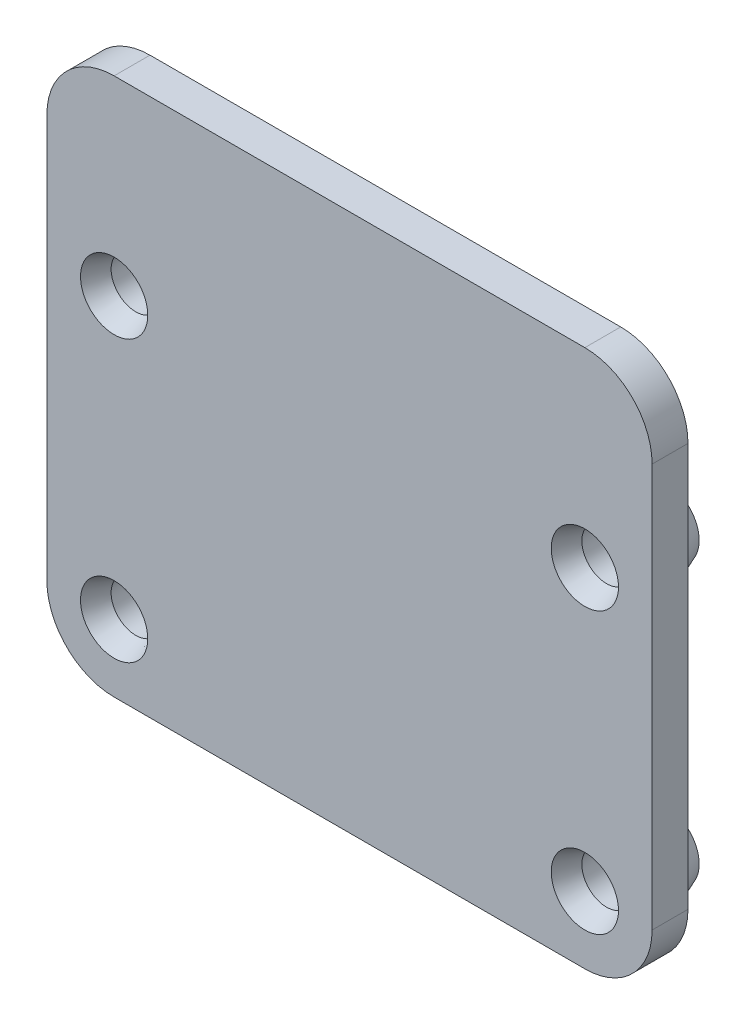
ISO-10303-21;
HEADER;
FILE_DESCRIPTION(('STEP AP214'),'2;1');
FILE_NAME('part.step','',(''),(''),'','','');
FILE_SCHEMA(('AUTOMOTIVE_DESIGN { 1 0 10303 214 1 1 1 1 }'));
ENDSEC;
DATA;
#1=APPLICATION_CONTEXT('core data for automotive mechanical design processes');
#2=APPLICATION_PROTOCOL_DEFINITION('international standard','automotive_design',2000,#1);
#3=PRODUCT_CONTEXT('',#1,'mechanical');
#4=PRODUCT('Part','Part','',(#3));
#5=PRODUCT_RELATED_PRODUCT_CATEGORY('part','',(#4));
#6=PRODUCT_DEFINITION_FORMATION('','',#4);
#7=PRODUCT_DEFINITION_CONTEXT('part definition',#1,'design');
#8=PRODUCT_DEFINITION('design','',#6,#7);
#9=PRODUCT_DEFINITION_SHAPE('','',#8);
#10=(LENGTH_UNIT() NAMED_UNIT(*) SI_UNIT(.MILLI.,.METRE.));
#11=(NAMED_UNIT(*) PLANE_ANGLE_UNIT() SI_UNIT($,.RADIAN.));
#12=(NAMED_UNIT(*) SI_UNIT($,.STERADIAN.) SOLID_ANGLE_UNIT());
#13=UNCERTAINTY_MEASURE_WITH_UNIT(LENGTH_MEASURE(1.E-05),#10,'distance_accuracy_value','');
#14=(GEOMETRIC_REPRESENTATION_CONTEXT(3) GLOBAL_UNCERTAINTY_ASSIGNED_CONTEXT((#13)) GLOBAL_UNIT_ASSIGNED_CONTEXT((#10,
#11,#12)) REPRESENTATION_CONTEXT('',''));
#15=CARTESIAN_POINT('',(0.,0.,0.));
#16=DIRECTION('',(0.,0.,1.));
#17=DIRECTION('',(1.,0.,0.));
#18=AXIS2_PLACEMENT_3D('',#15,#16,#17);
#19=CARTESIAN_POINT('',(-10.50000068,-7.51999610240276,1.6));
#20=DIRECTION('',(0.,0.,-1.));
#21=DIRECTION('',(-1.,0.,0.));
#22=AXIS2_PLACEMENT_3D('',#19,#20,#21);
#23=CYLINDRICAL_SURFACE('',#22,3.);
#24=CARTESIAN_POINT('',(-10.50000068,-7.51999610240276,0.));
#25=DIRECTION('',(0.,0.,1.));
#26=DIRECTION('',(-1.,0.,0.));
#27=AXIS2_PLACEMENT_3D('',#24,#25,#26);
#28=CIRCLE('',#27,3.);
#29=CARTESIAN_POINT('',(-13.50000068,-7.51999610240274,0.));
#30=VERTEX_POINT('',#29);
#31=CARTESIAN_POINT('',(-10.5000006799999,-10.5199961024028,0.));
#32=VERTEX_POINT('',#31);
#33=EDGE_CURVE('E134',#30,#32,#28,.T.);
#34=ORIENTED_EDGE('',*,*,#33,.T.);
#35=DIRECTION('',(0.,0.,-1.));
#36=VECTOR('',#35,1.);
#37=CARTESIAN_POINT('',(-10.5000006799999,-10.5199961024028,1.6));
#38=LINE('',#37,#36);
#39=CARTESIAN_POINT('',(-10.5000006799999,-10.5199961024028,1.6));
#40=VERTEX_POINT('',#39);
#41=EDGE_CURVE('E162',#40,#32,#38,.T.);
#42=ORIENTED_EDGE('',*,*,#41,.F.);
#43=CARTESIAN_POINT('',(-10.50000068,-7.51999610240276,1.6));
#44=DIRECTION('',(0.,0.,1.));
#45=DIRECTION('',(-1.,0.,0.));
#46=AXIS2_PLACEMENT_3D('',#43,#44,#45);
#47=CIRCLE('',#46,3.);
#48=CARTESIAN_POINT('',(-13.50000068,-7.51999610240274,1.6));
#49=VERTEX_POINT('',#48);
#50=EDGE_CURVE('E149',#49,#40,#47,.T.);
#51=ORIENTED_EDGE('',*,*,#50,.F.);
#52=DIRECTION('',(0.,0.,-1.));
#53=VECTOR('',#52,1.);
#54=CARTESIAN_POINT('',(-13.50000068,-7.51999610240274,1.6));
#55=LINE('',#54,#53);
#56=EDGE_CURVE('E130',#49,#30,#55,.T.);
#57=ORIENTED_EDGE('',*,*,#56,.T.);
#58=EDGE_LOOP('',(#34,#42,#51,#57));
#59=FACE_BOUND('',#58,.T.);
#60=ADVANCED_FACE('F35',(#59),#23,.T.);
#61=CARTESIAN_POINT('',(10.5000006799999,-10.5199961024028,1.6));
#62=DIRECTION('',(0.,1.,0.));
#63=DIRECTION('',(-1.,0.,0.));
#64=AXIS2_PLACEMENT_3D('',#61,#62,#63);
#65=PLANE('',#64);
#66=DIRECTION('',(1.,0.,0.));
#67=VECTOR('',#66,1.);
#68=CARTESIAN_POINT('',(10.5000006799999,-10.5199961024028,0.));
#69=LINE('',#68,#67);
#70=CARTESIAN_POINT('',(10.5000006799999,-10.5199961024028,0.));
#71=VERTEX_POINT('',#70);
#72=EDGE_CURVE('E137',#32,#71,#69,.T.);
#73=ORIENTED_EDGE('',*,*,#72,.T.);
#74=DIRECTION('',(0.,0.,-1.));
#75=VECTOR('',#74,1.);
#76=CARTESIAN_POINT('',(10.5000006799999,-10.5199961024028,1.6));
#77=LINE('',#76,#75);
#78=CARTESIAN_POINT('',(10.5000006799999,-10.5199961024028,1.6));
#79=VERTEX_POINT('',#78);
#80=EDGE_CURVE('E159',#79,#71,#77,.T.);
#81=ORIENTED_EDGE('',*,*,#80,.F.);
#82=DIRECTION('',(1.,0.,0.));
#83=VECTOR('',#82,1.);
#84=CARTESIAN_POINT('',(10.5000006799999,-10.5199961024028,1.6));
#85=LINE('',#84,#83);
#86=EDGE_CURVE('E97',#40,#79,#85,.T.);
#87=ORIENTED_EDGE('',*,*,#86,.F.);
#88=ORIENTED_EDGE('',*,*,#41,.T.);
#89=EDGE_LOOP('',(#73,#81,#87,#88));
#90=FACE_BOUND('',#89,.T.);
#91=ADVANCED_FACE('F190',(#90),#65,.F.);
#92=CARTESIAN_POINT('',(10.50000068,-7.51999610240276,1.6));
#93=DIRECTION('',(0.,0.,-1.));
#94=DIRECTION('',(-1.,0.,0.));
#95=AXIS2_PLACEMENT_3D('',#92,#93,#94);
#96=CYLINDRICAL_SURFACE('',#95,3.);
#97=CARTESIAN_POINT('',(10.50000068,-7.51999610240276,0.));
#98=DIRECTION('',(0.,0.,1.));
#99=DIRECTION('',(-1.,0.,0.));
#100=AXIS2_PLACEMENT_3D('',#97,#98,#99);
#101=CIRCLE('',#100,3.);
#102=CARTESIAN_POINT('',(13.50000068,-7.51999610240274,0.));
#103=VERTEX_POINT('',#102);
#104=EDGE_CURVE('E140',#71,#103,#101,.T.);
#105=ORIENTED_EDGE('',*,*,#104,.T.);
#106=DIRECTION('',(0.,0.,-1.));
#107=VECTOR('',#106,1.);
#108=CARTESIAN_POINT('',(13.50000068,-7.51999610240274,1.6));
#109=LINE('',#108,#107);
#110=CARTESIAN_POINT('',(13.50000068,-7.51999610240274,1.6));
#111=VERTEX_POINT('',#110);
#112=EDGE_CURVE('E156',#111,#103,#109,.T.);
#113=ORIENTED_EDGE('',*,*,#112,.F.);
#114=CARTESIAN_POINT('',(10.50000068,-7.51999610240276,1.6));
#115=DIRECTION('',(0.,0.,1.));
#116=DIRECTION('',(-1.,0.,0.));
#117=AXIS2_PLACEMENT_3D('',#114,#115,#116);
#118=CIRCLE('',#117,3.);
#119=EDGE_CURVE('E261',#79,#111,#118,.T.);
#120=ORIENTED_EDGE('',*,*,#119,.F.);
#121=ORIENTED_EDGE('',*,*,#80,.T.);
#122=EDGE_LOOP('',(#105,#113,#120,#121));
#123=FACE_BOUND('',#122,.T.);
#124=ADVANCED_FACE('F196',(#123),#96,.T.);
#125=CARTESIAN_POINT('',(13.50000068,10.4800038975972,1.6));
#126=DIRECTION('',(-1.,0.,0.));
#127=DIRECTION('',(0.,-1.,0.));
#128=AXIS2_PLACEMENT_3D('',#125,#126,#127);
#129=PLANE('',#128);
#130=DIRECTION('',(0.,1.,0.));
#131=VECTOR('',#130,1.);
#132=CARTESIAN_POINT('',(13.50000068,10.4800038975972,0.));
#133=LINE('',#132,#131);
#134=CARTESIAN_POINT('',(13.50000068,10.4800038975972,0.));
#135=VERTEX_POINT('',#134);
#136=EDGE_CURVE('E142',#103,#135,#133,.T.);
#137=ORIENTED_EDGE('',*,*,#136,.T.);
#138=DIRECTION('',(0.,0.,-1.));
#139=VECTOR('',#138,1.);
#140=CARTESIAN_POINT('',(13.50000068,10.4800038975972,1.6));
#141=LINE('',#140,#139);
#142=CARTESIAN_POINT('',(13.50000068,10.4800038975972,1.6));
#143=VERTEX_POINT('',#142);
#144=EDGE_CURVE('E153',#143,#135,#141,.T.);
#145=ORIENTED_EDGE('',*,*,#144,.F.);
#146=DIRECTION('',(0.,1.,0.));
#147=VECTOR('',#146,1.);
#148=CARTESIAN_POINT('',(13.50000068,10.4800038975972,1.6));
#149=LINE('',#148,#147);
#150=EDGE_CURVE('E263',#111,#143,#149,.T.);
#151=ORIENTED_EDGE('',*,*,#150,.F.);
#152=ORIENTED_EDGE('',*,*,#112,.T.);
#153=EDGE_LOOP('',(#137,#145,#151,#152));
#154=FACE_BOUND('',#153,.T.);
#155=ADVANCED_FACE('F269',(#154),#129,.F.);
#156=CARTESIAN_POINT('',(10.50000068,10.4800038975972,1.6));
#157=DIRECTION('',(0.,0.,-1.));
#158=DIRECTION('',(-1.,0.,0.));
#159=AXIS2_PLACEMENT_3D('',#156,#157,#158);
#160=CYLINDRICAL_SURFACE('',#159,3.);
#161=CARTESIAN_POINT('',(10.50000068,10.4800038975972,0.));
#162=DIRECTION('',(0.,0.,1.));
#163=DIRECTION('',(-1.,0.,0.));
#164=AXIS2_PLACEMENT_3D('',#161,#162,#163);
#165=CIRCLE('',#164,3.);
#166=CARTESIAN_POINT('',(10.5000006799999,13.4800038975972,0.));
#167=VERTEX_POINT('',#166);
#168=EDGE_CURVE('E144',#135,#167,#165,.T.);
#169=ORIENTED_EDGE('',*,*,#168,.T.);
#170=DIRECTION('',(0.,0.,-1.));
#171=VECTOR('',#170,1.);
#172=CARTESIAN_POINT('',(10.5000006799999,13.4800038975972,1.6));
#173=LINE('',#172,#171);
#174=CARTESIAN_POINT('',(10.5000006799999,13.4800038975972,1.6));
#175=VERTEX_POINT('',#174);
#176=EDGE_CURVE('E125',#175,#167,#173,.T.);
#177=ORIENTED_EDGE('',*,*,#176,.F.);
#178=CARTESIAN_POINT('',(10.50000068,10.4800038975972,1.6));
#179=DIRECTION('',(0.,0.,1.));
#180=DIRECTION('',(-1.,0.,0.));
#181=AXIS2_PLACEMENT_3D('',#178,#179,#180);
#182=CIRCLE('',#181,3.);
#183=EDGE_CURVE('E116',#143,#175,#182,.T.);
#184=ORIENTED_EDGE('',*,*,#183,.F.);
#185=ORIENTED_EDGE('',*,*,#144,.T.);
#186=EDGE_LOOP('',(#169,#177,#184,#185));
#187=FACE_BOUND('',#186,.T.);
#188=ADVANCED_FACE('F273',(#187),#160,.T.);
#189=CARTESIAN_POINT('',(10.5000006799999,13.4800038975972,1.6));
#190=DIRECTION('',(0.,-1.,0.));
#191=DIRECTION('',(1.,0.,0.));
#192=AXIS2_PLACEMENT_3D('',#189,#190,#191);
#193=PLANE('',#192);
#194=DIRECTION('',(-1.,0.,0.));
#195=VECTOR('',#194,1.);
#196=CARTESIAN_POINT('',(10.5000006799999,13.4800038975972,0.));
#197=LINE('',#196,#195);
#198=CARTESIAN_POINT('',(-10.5000006799999,13.4800038975972,0.));
#199=VERTEX_POINT('',#198);
#200=EDGE_CURVE('E124',#167,#199,#197,.T.);
#201=ORIENTED_EDGE('',*,*,#200,.T.);
#202=DIRECTION('',(0.,0.,-1.));
#203=VECTOR('',#202,1.);
#204=CARTESIAN_POINT('',(-10.5000006799999,13.4800038975972,1.6));
#205=LINE('',#204,#203);
#206=CARTESIAN_POINT('',(-10.5000006799999,13.4800038975972,1.6));
#207=VERTEX_POINT('',#206);
#208=EDGE_CURVE('E121',#207,#199,#205,.T.);
#209=ORIENTED_EDGE('',*,*,#208,.F.);
#210=DIRECTION('',(-1.,0.,0.));
#211=VECTOR('',#210,1.);
#212=CARTESIAN_POINT('',(10.5000006799999,13.4800038975972,1.6));
#213=LINE('',#212,#211);
#214=EDGE_CURVE('E110',#175,#207,#213,.T.);
#215=ORIENTED_EDGE('',*,*,#214,.F.);
#216=ORIENTED_EDGE('',*,*,#176,.T.);
#217=EDGE_LOOP('',(#201,#209,#215,#216));
#218=FACE_BOUND('',#217,.T.);
#219=ADVANCED_FACE('F122',(#218),#193,.F.);
#220=CARTESIAN_POINT('',(-10.50000068,10.4800038975972,1.6));
#221=DIRECTION('',(0.,0.,-1.));
#222=DIRECTION('',(-1.,0.,0.));
#223=AXIS2_PLACEMENT_3D('',#220,#221,#222);
#224=CYLINDRICAL_SURFACE('',#223,3.);
#225=CARTESIAN_POINT('',(-10.50000068,10.4800038975972,0.));
#226=DIRECTION('',(0.,0.,1.));
#227=DIRECTION('',(1.,0.,0.));
#228=AXIS2_PLACEMENT_3D('',#225,#226,#227);
#229=CIRCLE('',#228,3.);
#230=CARTESIAN_POINT('',(-13.50000068,10.4800038975972,0.));
#231=VERTEX_POINT('',#230);
#232=EDGE_CURVE('E82',#199,#231,#229,.T.);
#233=ORIENTED_EDGE('',*,*,#232,.T.);
#234=DIRECTION('',(0.,0.,-1.));
#235=VECTOR('',#234,1.);
#236=CARTESIAN_POINT('',(-13.50000068,10.4800038975972,1.6));
#237=LINE('',#236,#235);
#238=CARTESIAN_POINT('',(-13.50000068,10.4800038975972,1.6));
#239=VERTEX_POINT('',#238);
#240=EDGE_CURVE('E126',#239,#231,#237,.T.);
#241=ORIENTED_EDGE('',*,*,#240,.F.);
#242=CARTESIAN_POINT('',(-10.50000068,10.4800038975972,1.6));
#243=DIRECTION('',(0.,0.,1.));
#244=DIRECTION('',(1.,0.,0.));
#245=AXIS2_PLACEMENT_3D('',#242,#243,#244);
#246=CIRCLE('',#245,3.);
#247=EDGE_CURVE('E114',#207,#239,#246,.T.);
#248=ORIENTED_EDGE('',*,*,#247,.F.);
#249=ORIENTED_EDGE('',*,*,#208,.T.);
#250=EDGE_LOOP('',(#233,#241,#248,#249));
#251=FACE_BOUND('',#250,.T.);
#252=ADVANCED_FACE('F128',(#251),#224,.T.);
#253=CARTESIAN_POINT('',(-13.50000068,10.4800038975972,1.6));
#254=DIRECTION('',(1.,0.,0.));
#255=DIRECTION('',(0.,1.,0.));
#256=AXIS2_PLACEMENT_3D('',#253,#254,#255);
#257=PLANE('',#256);
#258=DIRECTION('',(0.,-1.,0.));
#259=VECTOR('',#258,1.);
#260=CARTESIAN_POINT('',(-13.50000068,10.4800038975972,0.));
#261=LINE('',#260,#259);
#262=EDGE_CURVE('E88',#231,#30,#261,.T.);
#263=ORIENTED_EDGE('',*,*,#262,.T.);
#264=ORIENTED_EDGE('',*,*,#56,.F.);
#265=DIRECTION('',(0.,-1.,0.));
#266=VECTOR('',#265,1.);
#267=CARTESIAN_POINT('',(-13.50000068,10.4800038975972,1.6));
#268=LINE('',#267,#266);
#269=EDGE_CURVE('E53',#239,#49,#268,.T.);
#270=ORIENTED_EDGE('',*,*,#269,.F.);
#271=ORIENTED_EDGE('',*,*,#240,.T.);
#272=EDGE_LOOP('',(#263,#264,#270,#271));
#273=FACE_BOUND('',#272,.T.);
#274=ADVANCED_FACE('F280',(#273),#257,.F.);
#275=CARTESIAN_POINT('',(-10.50000068,-7.51999610240276,1.6));
#276=DIRECTION('',(0.,0.,-1.));
#277=DIRECTION('',(-1.,0.,0.));
#278=AXIS2_PLACEMENT_3D('',#275,#276,#277);
#279=PLANE('',#278);
#280=CARTESIAN_POINT('',(10.5000012647635,4.98000389759722,1.6));
#281=DIRECTION('',(0.,0.,1.));
#282=DIRECTION('',(1.,0.,0.));
#283=AXIS2_PLACEMENT_3D('',#280,#281,#282);
#284=CIRCLE('',#283,1.5);
#285=CARTESIAN_POINT('',(12.0000012647635,4.98000389759722,1.6));
#286=VERTEX_POINT('',#285);
#287=EDGE_CURVE('E487',#286,#286,#284,.T.);
#288=ORIENTED_EDGE('',*,*,#287,.F.);
#289=EDGE_LOOP('',(#288));
#290=FACE_BOUND('',#289,.T.);
#291=CARTESIAN_POINT('',(10.50000068,-7.51999610240276,1.6));
#292=DIRECTION('',(0.,0.,1.));
#293=DIRECTION('',(1.,0.,0.));
#294=AXIS2_PLACEMENT_3D('',#291,#292,#293);
#295=CIRCLE('',#294,1.5);
#296=CARTESIAN_POINT('',(12.00000068,-7.51999610240276,1.6));
#297=VERTEX_POINT('',#296);
#298=EDGE_CURVE('E476',#297,#297,#295,.T.);
#299=ORIENTED_EDGE('',*,*,#298,.F.);
#300=EDGE_LOOP('',(#299));
#301=FACE_BOUND('',#300,.T.);
#302=CARTESIAN_POINT('',(-10.49999932,-7.51999511999999,1.6));
#303=DIRECTION('',(0.,0.,1.));
#304=DIRECTION('',(1.,0.,0.));
#305=AXIS2_PLACEMENT_3D('',#302,#303,#304);
#306=CIRCLE('',#305,1.5);
#307=CARTESIAN_POINT('',(-8.99999931999997,-7.51999511999999,1.6));
#308=VERTEX_POINT('',#307);
#309=EDGE_CURVE('E242',#308,#308,#306,.T.);
#310=ORIENTED_EDGE('',*,*,#309,.F.);
#311=EDGE_LOOP('',(#310));
#312=FACE_BOUND('',#311,.T.);
#313=CARTESIAN_POINT('',(-10.4999987352365,4.98000487999999,1.6));
#314=DIRECTION('',(0.,0.,1.));
#315=DIRECTION('',(1.,0.,0.));
#316=AXIS2_PLACEMENT_3D('',#313,#314,#315);
#317=CIRCLE('',#316,1.5);
#318=CARTESIAN_POINT('',(-8.99999873523645,4.98000487999999,1.6));
#319=VERTEX_POINT('',#318);
#320=EDGE_CURVE('E235',#319,#319,#317,.T.);
#321=ORIENTED_EDGE('',*,*,#320,.F.);
#322=EDGE_LOOP('',(#321));
#323=FACE_BOUND('',#322,.T.);
#324=ORIENTED_EDGE('',*,*,#50,.T.);
#325=ORIENTED_EDGE('',*,*,#86,.T.);
#326=ORIENTED_EDGE('',*,*,#119,.T.);
#327=ORIENTED_EDGE('',*,*,#150,.T.);
#328=ORIENTED_EDGE('',*,*,#183,.T.);
#329=ORIENTED_EDGE('',*,*,#214,.T.);
#330=ORIENTED_EDGE('',*,*,#247,.T.);
#331=ORIENTED_EDGE('',*,*,#269,.T.);
#332=EDGE_LOOP('',(#324,#325,#326,#327,#328,#329,#330,#331));
#333=FACE_BOUND('',#332,.T.);
#334=ADVANCED_FACE('F112',(#290,#301,#312,#323,#333),#279,.F.);
#335=CARTESIAN_POINT('',(-10.50000068,-7.51999610240276,0.));
#336=DIRECTION('',(0.,0.,-1.));
#337=DIRECTION('',(-1.,0.,0.));
#338=AXIS2_PLACEMENT_3D('',#335,#336,#337);
#339=PLANE('',#338);
#340=CARTESIAN_POINT('',(10.50000068,-7.51999610240276,0.));
#341=DIRECTION('',(0.,0.,-1.));
#342=DIRECTION('',(-1.,0.,0.));
#343=AXIS2_PLACEMENT_3D('',#340,#341,#342);
#344=CIRCLE('',#343,2.3);
#345=CARTESIAN_POINT('',(8.20000067999997,-7.51999610240276,0.));
#346=VERTEX_POINT('',#345);
#347=EDGE_CURVE('E251',#346,#346,#344,.T.);
#348=ORIENTED_EDGE('',*,*,#347,.F.);
#349=EDGE_LOOP('',(#348));
#350=FACE_BOUND('',#349,.T.);
#351=CARTESIAN_POINT('',(-10.50000068,-7.51999610240276,0.));
#352=DIRECTION('',(0.,0.,-1.));
#353=DIRECTION('',(-1.,0.,0.));
#354=AXIS2_PLACEMENT_3D('',#351,#352,#353);
#355=CIRCLE('',#354,2.3);
#356=CARTESIAN_POINT('',(-12.80000068,-7.51999610240276,0.));
#357=VERTEX_POINT('',#356);
#358=EDGE_CURVE('E222',#357,#357,#355,.T.);
#359=ORIENTED_EDGE('',*,*,#358,.F.);
#360=EDGE_LOOP('',(#359));
#361=FACE_BOUND('',#360,.T.);
#362=CARTESIAN_POINT('',(-10.4999987352365,4.98000487999999,0.));
#363=DIRECTION('',(0.,0.,-1.));
#364=DIRECTION('',(-1.,0.,0.));
#365=AXIS2_PLACEMENT_3D('',#362,#363,#364);
#366=CIRCLE('',#365,2.3);
#367=CARTESIAN_POINT('',(-12.7999987352365,4.98000487999999,0.));
#368=VERTEX_POINT('',#367);
#369=EDGE_CURVE('E255',#368,#368,#366,.T.);
#370=ORIENTED_EDGE('',*,*,#369,.F.);
#371=EDGE_LOOP('',(#370));
#372=FACE_BOUND('',#371,.T.);
#373=CARTESIAN_POINT('',(10.5000012647635,4.98000389759722,0.));
#374=DIRECTION('',(0.,0.,-1.));
#375=DIRECTION('',(-1.,0.,0.));
#376=AXIS2_PLACEMENT_3D('',#373,#374,#375);
#377=CIRCLE('',#376,2.3);
#378=CARTESIAN_POINT('',(8.20000126476353,4.98000389759722,0.));
#379=VERTEX_POINT('',#378);
#380=EDGE_CURVE('E138',#379,#379,#377,.T.);
#381=ORIENTED_EDGE('',*,*,#380,.F.);
#382=EDGE_LOOP('',(#381));
#383=FACE_BOUND('',#382,.T.);
#384=ORIENTED_EDGE('',*,*,#33,.F.);
#385=ORIENTED_EDGE('',*,*,#262,.F.);
#386=ORIENTED_EDGE('',*,*,#232,.F.);
#387=ORIENTED_EDGE('',*,*,#200,.F.);
#388=ORIENTED_EDGE('',*,*,#168,.F.);
#389=ORIENTED_EDGE('',*,*,#136,.F.);
#390=ORIENTED_EDGE('',*,*,#104,.F.);
#391=ORIENTED_EDGE('',*,*,#72,.F.);
#392=EDGE_LOOP('',(#384,#385,#386,#387,#388,#389,#390,#391));
#393=FACE_BOUND('',#392,.T.);
#394=ADVANCED_FACE('F276',(#350,#361,#372,#383,#393),#339,.T.);
#395=CARTESIAN_POINT('',(10.5000012647635,4.98000389759722,-2.));
#396=DIRECTION('',(0.,0.,-1.));
#397=DIRECTION('',(-1.,0.,0.));
#398=AXIS2_PLACEMENT_3D('',#395,#396,#397);
#399=PLANE('',#398);
#400=CARTESIAN_POINT('',(10.5000012647635,4.98000389759722,-2.));
#401=DIRECTION('',(0.,0.,-1.));
#402=DIRECTION('',(-1.,0.,0.));
#403=AXIS2_PLACEMENT_3D('',#400,#401,#402);
#404=CIRCLE('',#403,1.49999999999999);
#405=CARTESIAN_POINT('',(9.00000126476354,4.98000389759722,-2.));
#406=VERTEX_POINT('',#405);
#407=EDGE_CURVE('E45',#406,#406,#404,.T.);
#408=ORIENTED_EDGE('',*,*,#407,.T.);
#409=EDGE_LOOP('',(#408));
#410=FACE_BOUND('',#409,.T.);
#411=CARTESIAN_POINT('',(10.5000012647635,4.98000389759722,-2.));
#412=DIRECTION('',(0.,0.,1.));
#413=DIRECTION('',(1.,0.,0.));
#414=AXIS2_PLACEMENT_3D('',#411,#412,#413);
#415=CIRCLE('',#414,1.1);
#416=CARTESIAN_POINT('',(11.6000012647635,4.98000389759722,-2.));
#417=VERTEX_POINT('',#416);
#418=EDGE_CURVE('E481',#417,#417,#415,.T.);
#419=ORIENTED_EDGE('',*,*,#418,.T.);
#420=EDGE_LOOP('',(#419));
#421=FACE_BOUND('',#420,.T.);
#422=ADVANCED_FACE('F172',(#410,#421),#399,.T.);
#423=CARTESIAN_POINT('',(-10.4999987352365,4.98000487999999,-2.));
#424=DIRECTION('',(0.,0.,-1.));
#425=DIRECTION('',(-1.,0.,0.));
#426=AXIS2_PLACEMENT_3D('',#423,#424,#425);
#427=PLANE('',#426);
#428=CARTESIAN_POINT('',(-10.4999987352365,4.98000487999999,-2.));
#429=DIRECTION('',(0.,0.,-1.));
#430=DIRECTION('',(-1.,0.,0.));
#431=AXIS2_PLACEMENT_3D('',#428,#429,#430);
#432=CIRCLE('',#431,1.49999999999999);
#433=CARTESIAN_POINT('',(-11.9999987352364,4.98000487999999,-2.));
#434=VERTEX_POINT('',#433);
#435=EDGE_CURVE('E167',#434,#434,#432,.T.);
#436=ORIENTED_EDGE('',*,*,#435,.T.);
#437=EDGE_LOOP('',(#436));
#438=FACE_BOUND('',#437,.T.);
#439=CARTESIAN_POINT('',(-10.4999987352365,4.98000487999999,-2.));
#440=DIRECTION('',(0.,0.,1.));
#441=DIRECTION('',(1.,0.,0.));
#442=AXIS2_PLACEMENT_3D('',#439,#440,#441);
#443=CIRCLE('',#442,1.1);
#444=CARTESIAN_POINT('',(-9.39999873523645,4.98000487999999,-2.));
#445=VERTEX_POINT('',#444);
#446=EDGE_CURVE('E248',#445,#445,#443,.T.);
#447=ORIENTED_EDGE('',*,*,#446,.T.);
#448=EDGE_LOOP('',(#447));
#449=FACE_BOUND('',#448,.T.);
#450=ADVANCED_FACE('F229',(#438,#449),#427,.T.);
#451=CARTESIAN_POINT('',(-10.50000068,-7.51999610240276,-2.));
#452=DIRECTION('',(0.,0.,-1.));
#453=DIRECTION('',(-1.,0.,0.));
#454=AXIS2_PLACEMENT_3D('',#451,#452,#453);
#455=PLANE('',#454);
#456=CARTESIAN_POINT('',(-10.50000068,-7.51999610240276,-2.));
#457=DIRECTION('',(0.,0.,-1.));
#458=DIRECTION('',(-1.,0.,0.));
#459=AXIS2_PLACEMENT_3D('',#456,#457,#458);
#460=CIRCLE('',#459,1.49999999999999);
#461=CARTESIAN_POINT('',(-12.00000068,-7.51999610240276,-2.));
#462=VERTEX_POINT('',#461);
#463=EDGE_CURVE('E164',#462,#462,#460,.T.);
#464=ORIENTED_EDGE('',*,*,#463,.T.);
#465=EDGE_LOOP('',(#464));
#466=FACE_BOUND('',#465,.T.);
#467=CARTESIAN_POINT('',(-10.49999932,-7.51999511999999,-2.));
#468=DIRECTION('',(0.,0.,1.));
#469=DIRECTION('',(1.,0.,0.));
#470=AXIS2_PLACEMENT_3D('',#467,#468,#469);
#471=CIRCLE('',#470,1.1);
#472=CARTESIAN_POINT('',(-9.39999931999997,-7.51999511999999,-2.));
#473=VERTEX_POINT('',#472);
#474=EDGE_CURVE('E233',#473,#473,#471,.T.);
#475=ORIENTED_EDGE('',*,*,#474,.T.);
#476=EDGE_LOOP('',(#475));
#477=FACE_BOUND('',#476,.T.);
#478=ADVANCED_FACE('F225',(#466,#477),#455,.T.);
#479=CARTESIAN_POINT('',(10.50000068,-7.51999610240276,-2.));
#480=DIRECTION('',(0.,0.,-1.));
#481=DIRECTION('',(-1.,0.,0.));
#482=AXIS2_PLACEMENT_3D('',#479,#480,#481);
#483=PLANE('',#482);
#484=CARTESIAN_POINT('',(10.50000068,-7.51999610240276,-2.));
#485=DIRECTION('',(0.,0.,-1.));
#486=DIRECTION('',(-1.,0.,0.));
#487=AXIS2_PLACEMENT_3D('',#484,#485,#486);
#488=CIRCLE('',#487,1.49999999999999);
#489=CARTESIAN_POINT('',(9.00000067999998,-7.51999610240276,-2.));
#490=VERTEX_POINT('',#489);
#491=EDGE_CURVE('E11',#490,#490,#488,.T.);
#492=ORIENTED_EDGE('',*,*,#491,.T.);
#493=EDGE_LOOP('',(#492));
#494=FACE_BOUND('',#493,.T.);
#495=CARTESIAN_POINT('',(10.50000068,-7.51999610240276,-2.));
#496=DIRECTION('',(0.,0.,1.));
#497=DIRECTION('',(1.,0.,0.));
#498=AXIS2_PLACEMENT_3D('',#495,#496,#497);
#499=CIRCLE('',#498,1.1);
#500=CARTESIAN_POINT('',(11.60000068,-7.51999610240276,-2.));
#501=VERTEX_POINT('',#500);
#502=EDGE_CURVE('E471',#501,#501,#499,.T.);
#503=ORIENTED_EDGE('',*,*,#502,.T.);
#504=EDGE_LOOP('',(#503));
#505=FACE_BOUND('',#504,.T.);
#506=ADVANCED_FACE('F228',(#494,#505),#483,.T.);
#507=CARTESIAN_POINT('',(-10.4999987352365,4.98000487999999,1.6));
#508=DIRECTION('',(0.,0.,1.));
#509=DIRECTION('',(1.,0.,0.));
#510=AXIS2_PLACEMENT_3D('',#507,#508,#509);
#511=CYLINDRICAL_SURFACE('',#510,1.1);
#512=ORIENTED_EDGE('',*,*,#446,.F.);
#513=EDGE_LOOP('',(#512));
#514=FACE_BOUND('',#513,.T.);
#515=CARTESIAN_POINT('',(-10.4999987352365,4.98000487999999,0.634314575050763));
#516=DIRECTION('',(0.,0.,1.));
#517=DIRECTION('',(1.,0.,0.));
#518=AXIS2_PLACEMENT_3D('',#515,#516,#517);
#519=CIRCLE('',#518,1.1);
#520=CARTESIAN_POINT('',(-9.39999873523645,4.98000487999999,0.634314575050763));
#521=VERTEX_POINT('',#520);
#522=EDGE_CURVE('E239',#521,#521,#519,.T.);
#523=ORIENTED_EDGE('',*,*,#522,.T.);
#524=EDGE_LOOP('',(#523));
#525=FACE_BOUND('',#524,.T.);
#526=ADVANCED_FACE('F344',(#514,#525),#511,.F.);
#527=CARTESIAN_POINT('',(-10.4999987352365,4.98000487999999,1.6));
#528=DIRECTION('',(0.,0.,1.));
#529=DIRECTION('',(1.,0.,0.));
#530=AXIS2_PLACEMENT_3D('',#527,#528,#529);
#531=CONICAL_SURFACE('',#530,1.5,0.392699081698725);
#532=ORIENTED_EDGE('',*,*,#522,.F.);
#533=EDGE_LOOP('',(#532));
#534=FACE_BOUND('',#533,.T.);
#535=ORIENTED_EDGE('',*,*,#320,.T.);
#536=EDGE_LOOP('',(#535));
#537=FACE_BOUND('',#536,.T.);
#538=ADVANCED_FACE('F349',(#534,#537),#531,.F.);
#539=CARTESIAN_POINT('',(-10.49999932,-7.51999511999999,1.6));
#540=DIRECTION('',(0.,0.,1.));
#541=DIRECTION('',(1.,0.,0.));
#542=AXIS2_PLACEMENT_3D('',#539,#540,#541);
#543=CYLINDRICAL_SURFACE('',#542,1.1);
#544=ORIENTED_EDGE('',*,*,#474,.F.);
#545=EDGE_LOOP('',(#544));
#546=FACE_BOUND('',#545,.T.);
#547=CARTESIAN_POINT('',(-10.49999932,-7.51999511999999,0.634314575050763));
#548=DIRECTION('',(0.,0.,1.));
#549=DIRECTION('',(1.,0.,0.));
#550=AXIS2_PLACEMENT_3D('',#547,#548,#549);
#551=CIRCLE('',#550,1.1);
#552=CARTESIAN_POINT('',(-9.39999931999997,-7.51999511999999,0.634314575050763));
#553=VERTEX_POINT('',#552);
#554=EDGE_CURVE('E236',#553,#553,#551,.T.);
#555=ORIENTED_EDGE('',*,*,#554,.T.);
#556=EDGE_LOOP('',(#555));
#557=FACE_BOUND('',#556,.T.);
#558=ADVANCED_FACE('F361',(#546,#557),#543,.F.);
#559=CARTESIAN_POINT('',(-10.49999932,-7.51999511999999,1.6));
#560=DIRECTION('',(0.,0.,1.));
#561=DIRECTION('',(1.,0.,0.));
#562=AXIS2_PLACEMENT_3D('',#559,#560,#561);
#563=CONICAL_SURFACE('',#562,1.5,0.392699081698725);
#564=ORIENTED_EDGE('',*,*,#554,.F.);
#565=EDGE_LOOP('',(#564));
#566=FACE_BOUND('',#565,.T.);
#567=ORIENTED_EDGE('',*,*,#309,.T.);
#568=EDGE_LOOP('',(#567));
#569=FACE_BOUND('',#568,.T.);
#570=ADVANCED_FACE('F371',(#566,#569),#563,.F.);
#571=CARTESIAN_POINT('',(10.50000068,-7.51999610240276,1.6));
#572=DIRECTION('',(0.,0.,1.));
#573=DIRECTION('',(1.,0.,0.));
#574=AXIS2_PLACEMENT_3D('',#571,#572,#573);
#575=CYLINDRICAL_SURFACE('',#574,1.1);
#576=ORIENTED_EDGE('',*,*,#502,.F.);
#577=EDGE_LOOP('',(#576));
#578=FACE_BOUND('',#577,.T.);
#579=CARTESIAN_POINT('',(10.50000068,-7.51999610240276,0.634314575050763));
#580=DIRECTION('',(0.,0.,1.));
#581=DIRECTION('',(1.,0.,0.));
#582=AXIS2_PLACEMENT_3D('',#579,#580,#581);
#583=CIRCLE('',#582,1.1);
#584=CARTESIAN_POINT('',(11.60000068,-7.51999610240276,0.634314575050763));
#585=VERTEX_POINT('',#584);
#586=EDGE_CURVE('E472',#585,#585,#583,.T.);
#587=ORIENTED_EDGE('',*,*,#586,.T.);
#588=EDGE_LOOP('',(#587));
#589=FACE_BOUND('',#588,.T.);
#590=ADVANCED_FACE('F380',(#578,#589),#575,.F.);
#591=CARTESIAN_POINT('',(10.50000068,-7.51999610240276,1.6));
#592=DIRECTION('',(0.,0.,1.));
#593=DIRECTION('',(1.,0.,0.));
#594=AXIS2_PLACEMENT_3D('',#591,#592,#593);
#595=CONICAL_SURFACE('',#594,1.5,0.392699081698725);
#596=ORIENTED_EDGE('',*,*,#586,.F.);
#597=EDGE_LOOP('',(#596));
#598=FACE_BOUND('',#597,.T.);
#599=ORIENTED_EDGE('',*,*,#298,.T.);
#600=EDGE_LOOP('',(#599));
#601=FACE_BOUND('',#600,.T.);
#602=ADVANCED_FACE('F390',(#598,#601),#595,.F.);
#603=CARTESIAN_POINT('',(10.5000012647635,4.98000389759722,1.6));
#604=DIRECTION('',(0.,0.,1.));
#605=DIRECTION('',(1.,0.,0.));
#606=AXIS2_PLACEMENT_3D('',#603,#604,#605);
#607=CYLINDRICAL_SURFACE('',#606,1.1);
#608=ORIENTED_EDGE('',*,*,#418,.F.);
#609=EDGE_LOOP('',(#608));
#610=FACE_BOUND('',#609,.T.);
#611=CARTESIAN_POINT('',(10.5000012647635,4.98000389759722,0.634314575050763));
#612=DIRECTION('',(0.,0.,1.));
#613=DIRECTION('',(1.,0.,0.));
#614=AXIS2_PLACEMENT_3D('',#611,#612,#613);
#615=CIRCLE('',#614,1.1);
#616=CARTESIAN_POINT('',(11.6000012647635,4.98000389759722,0.634314575050763));
#617=VERTEX_POINT('',#616);
#618=EDGE_CURVE('E484',#617,#617,#615,.T.);
#619=ORIENTED_EDGE('',*,*,#618,.T.);
#620=EDGE_LOOP('',(#619));
#621=FACE_BOUND('',#620,.T.);
#622=ADVANCED_FACE('F216',(#610,#621),#607,.F.);
#623=CARTESIAN_POINT('',(10.5000012647635,4.98000389759722,1.6));
#624=DIRECTION('',(0.,0.,1.));
#625=DIRECTION('',(1.,0.,0.));
#626=AXIS2_PLACEMENT_3D('',#623,#624,#625);
#627=CONICAL_SURFACE('',#626,1.5,0.392699081698725);
#628=ORIENTED_EDGE('',*,*,#618,.F.);
#629=EDGE_LOOP('',(#628));
#630=FACE_BOUND('',#629,.T.);
#631=ORIENTED_EDGE('',*,*,#287,.T.);
#632=EDGE_LOOP('',(#631));
#633=FACE_BOUND('',#632,.T.);
#634=ADVANCED_FACE('F205',(#630,#633),#627,.F.);
#635=CARTESIAN_POINT('',(-10.50000068,-7.51999610240276,-2.));
#636=DIRECTION('',(0.,0.,1.));
#637=DIRECTION('',(1.,0.,0.));
#638=AXIS2_PLACEMENT_3D('',#635,#636,#637);
#639=CONICAL_SURFACE('',#638,1.49999999999999,0.380506377112362);
#640=ORIENTED_EDGE('',*,*,#358,.T.);
#641=EDGE_LOOP('',(#640));
#642=FACE_BOUND('',#641,.T.);
#643=ORIENTED_EDGE('',*,*,#463,.F.);
#644=EDGE_LOOP('',(#643));
#645=FACE_BOUND('',#644,.T.);
#646=ADVANCED_FACE('F184',(#642,#645),#639,.T.);
#647=CARTESIAN_POINT('',(-10.4999987352365,4.98000487999999,-2.));
#648=DIRECTION('',(0.,0.,1.));
#649=DIRECTION('',(1.,0.,0.));
#650=AXIS2_PLACEMENT_3D('',#647,#648,#649);
#651=CONICAL_SURFACE('',#650,1.49999999999999,0.380506377112362);
#652=ORIENTED_EDGE('',*,*,#369,.T.);
#653=EDGE_LOOP('',(#652));
#654=FACE_BOUND('',#653,.T.);
#655=ORIENTED_EDGE('',*,*,#435,.F.);
#656=EDGE_LOOP('',(#655));
#657=FACE_BOUND('',#656,.T.);
#658=ADVANCED_FACE('F177',(#654,#657),#651,.T.);
#659=CARTESIAN_POINT('',(10.5000012647635,4.98000389759722,-2.));
#660=DIRECTION('',(0.,0.,1.));
#661=DIRECTION('',(1.,0.,0.));
#662=AXIS2_PLACEMENT_3D('',#659,#660,#661);
#663=CONICAL_SURFACE('',#662,1.49999999999999,0.380506377112362);
#664=ORIENTED_EDGE('',*,*,#380,.T.);
#665=EDGE_LOOP('',(#664));
#666=FACE_BOUND('',#665,.T.);
#667=ORIENTED_EDGE('',*,*,#407,.F.);
#668=EDGE_LOOP('',(#667));
#669=FACE_BOUND('',#668,.T.);
#670=ADVANCED_FACE('F175',(#666,#669),#663,.T.);
#671=CARTESIAN_POINT('',(10.50000068,-7.51999610240276,-2.));
#672=DIRECTION('',(0.,0.,1.));
#673=DIRECTION('',(1.,0.,0.));
#674=AXIS2_PLACEMENT_3D('',#671,#672,#673);
#675=CONICAL_SURFACE('',#674,1.49999999999999,0.380506377112362);
#676=ORIENTED_EDGE('',*,*,#347,.T.);
#677=EDGE_LOOP('',(#676));
#678=FACE_BOUND('',#677,.T.);
#679=ORIENTED_EDGE('',*,*,#491,.F.);
#680=EDGE_LOOP('',(#679));
#681=FACE_BOUND('',#680,.T.);
#682=ADVANCED_FACE('F38',(#678,#681),#675,.T.);
#683=CLOSED_SHELL('',(#60,#91,#124,#155,#188,#219,#252,#274,#334,#394,#422,#450,#478,#506,#526,
#538,#558,#570,#590,#602,#622,#634,#646,#658,#670,#682));
#684=MANIFOLD_SOLID_BREP('B2',#683);
#685=ADVANCED_BREP_SHAPE_REPRESENTATION('',(#18,#684),#14);
#686=SHAPE_DEFINITION_REPRESENTATION(#9,#685);
ENDSEC;
END-ISO-10303-21;
